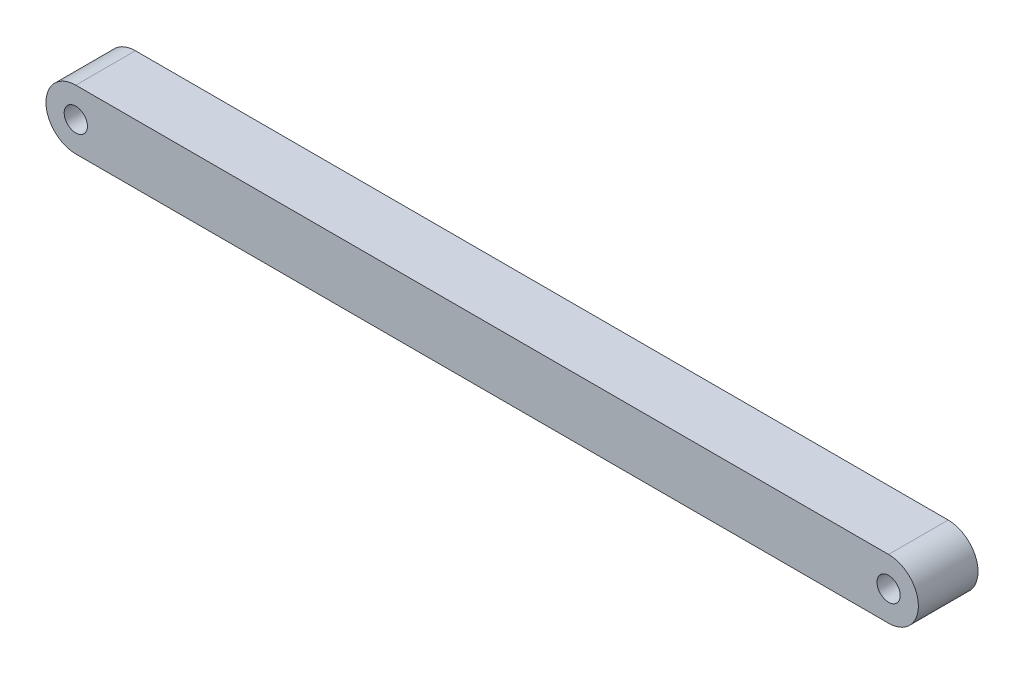
ISO-10303-21;
HEADER;
FILE_DESCRIPTION(('STEP AP214'),'2;1');
FILE_NAME('part.step','',(''),(''),'','','');
FILE_SCHEMA(('AUTOMOTIVE_DESIGN { 1 0 10303 214 1 1 1 1 }'));
ENDSEC;
DATA;
#1=APPLICATION_CONTEXT('core data for automotive mechanical design processes');
#2=APPLICATION_PROTOCOL_DEFINITION('international standard','automotive_design',2000,#1);
#3=PRODUCT_CONTEXT('',#1,'mechanical');
#4=PRODUCT('Part','Part','',(#3));
#5=PRODUCT_RELATED_PRODUCT_CATEGORY('part','',(#4));
#6=PRODUCT_DEFINITION_FORMATION('','',#4);
#7=PRODUCT_DEFINITION_CONTEXT('part definition',#1,'design');
#8=PRODUCT_DEFINITION('design','',#6,#7);
#9=PRODUCT_DEFINITION_SHAPE('','',#8);
#10=(LENGTH_UNIT() NAMED_UNIT(*) SI_UNIT(.MILLI.,.METRE.));
#11=(NAMED_UNIT(*) PLANE_ANGLE_UNIT() SI_UNIT($,.RADIAN.));
#12=(NAMED_UNIT(*) SI_UNIT($,.STERADIAN.) SOLID_ANGLE_UNIT());
#13=UNCERTAINTY_MEASURE_WITH_UNIT(LENGTH_MEASURE(1.E-05),#10,'distance_accuracy_value','');
#14=(GEOMETRIC_REPRESENTATION_CONTEXT(3) GLOBAL_UNCERTAINTY_ASSIGNED_CONTEXT((#13)) GLOBAL_UNIT_ASSIGNED_CONTEXT((#10,
#11,#12)) REPRESENTATION_CONTEXT('',''));
#15=CARTESIAN_POINT('',(0.,0.,0.));
#16=DIRECTION('',(0.,0.,1.));
#17=DIRECTION('',(1.,0.,0.));
#18=AXIS2_PLACEMENT_3D('',#15,#16,#17);
#19=CARTESIAN_POINT('',(150.,10.25,20.5));
#20=DIRECTION('',(0.,0.,1.));
#21=DIRECTION('',(1.,0.,0.));
#22=AXIS2_PLACEMENT_3D('',#19,#20,#21);
#23=PLANE('',#22);
#24=CARTESIAN_POINT('',(10.25,10.25,20.5));
#25=DIRECTION('',(0.,0.,1.));
#26=DIRECTION('',(1.,0.,0.));
#27=AXIS2_PLACEMENT_3D('',#24,#25,#26);
#28=CIRCLE('',#27,4.);
#29=CARTESIAN_POINT('',(14.25,10.25,20.5));
#30=VERTEX_POINT('',#29);
#31=EDGE_CURVE('E88',#30,#30,#28,.F.);
#32=ORIENTED_EDGE('',*,*,#31,.T.);
#33=EDGE_LOOP('',(#32));
#34=FACE_BOUND('',#33,.T.);
#35=CARTESIAN_POINT('',(289.75,10.25,20.5));
#36=DIRECTION('',(0.,0.,1.));
#37=DIRECTION('',(1.,0.,0.));
#38=AXIS2_PLACEMENT_3D('',#35,#36,#37);
#39=CIRCLE('',#38,4.);
#40=CARTESIAN_POINT('',(293.75,10.25,20.5));
#41=VERTEX_POINT('',#40);
#42=EDGE_CURVE('E91',#41,#41,#39,.F.);
#43=ORIENTED_EDGE('',*,*,#42,.T.);
#44=EDGE_LOOP('',(#43));
#45=FACE_BOUND('',#44,.T.);
#46=CARTESIAN_POINT('',(289.75,10.25,20.5));
#47=DIRECTION('',(0.,0.,1.));
#48=DIRECTION('',(1.,0.,0.));
#49=AXIS2_PLACEMENT_3D('',#46,#47,#48);
#50=CIRCLE('',#49,10.25);
#51=CARTESIAN_POINT('',(289.75,20.5,20.5));
#52=VERTEX_POINT('',#51);
#53=CARTESIAN_POINT('',(289.75,0.,20.5));
#54=VERTEX_POINT('',#53);
#55=EDGE_CURVE('E19',#52,#54,#50,.F.);
#56=ORIENTED_EDGE('',*,*,#55,.F.);
#57=DIRECTION('',(1.,0.,0.));
#58=VECTOR('',#57,1.);
#59=CARTESIAN_POINT('',(300.,20.5,20.5));
#60=LINE('',#59,#58);
#61=CARTESIAN_POINT('',(10.25,20.5,20.5));
#62=VERTEX_POINT('',#61);
#63=EDGE_CURVE('E53',#62,#52,#60,.T.);
#64=ORIENTED_EDGE('',*,*,#63,.F.);
#65=CARTESIAN_POINT('',(10.25,10.25,20.5));
#66=DIRECTION('',(0.,0.,1.));
#67=DIRECTION('',(1.,0.,0.));
#68=AXIS2_PLACEMENT_3D('',#65,#66,#67);
#69=CIRCLE('',#68,10.25);
#70=CARTESIAN_POINT('',(10.25,0.,20.5));
#71=VERTEX_POINT('',#70);
#72=EDGE_CURVE('E68',#71,#62,#69,.F.);
#73=ORIENTED_EDGE('',*,*,#72,.F.);
#74=DIRECTION('',(1.,0.,0.));
#75=VECTOR('',#74,1.);
#76=CARTESIAN_POINT('',(0.,0.,20.5));
#77=LINE('',#76,#75);
#78=EDGE_CURVE('E66',#54,#71,#77,.F.);
#79=ORIENTED_EDGE('',*,*,#78,.F.);
#80=EDGE_LOOP('',(#56,#64,#73,#79));
#81=FACE_BOUND('',#80,.T.);
#82=ADVANCED_FACE('F16',(#34,#45,#81),#23,.T.);
#83=CARTESIAN_POINT('',(0.,0.,0.));
#84=DIRECTION('',(0.,-1.,0.));
#85=DIRECTION('',(0.,0.,-1.));
#86=AXIS2_PLACEMENT_3D('',#83,#84,#85);
#87=PLANE('',#86);
#88=DIRECTION('',(0.,0.,1.));
#89=VECTOR('',#88,1.);
#90=CARTESIAN_POINT('',(289.75,0.,0.));
#91=LINE('',#90,#89);
#92=CARTESIAN_POINT('',(289.75,0.,0.));
#93=VERTEX_POINT('',#92);
#94=EDGE_CURVE('E62',#54,#93,#91,.F.);
#95=ORIENTED_EDGE('',*,*,#94,.F.);
#96=ORIENTED_EDGE('',*,*,#78,.T.);
#97=DIRECTION('',(0.,0.,1.));
#98=VECTOR('',#97,1.);
#99=CARTESIAN_POINT('',(10.25,0.,0.));
#100=LINE('',#99,#98);
#101=CARTESIAN_POINT('',(10.25,0.,0.));
#102=VERTEX_POINT('',#101);
#103=EDGE_CURVE('E93',#102,#71,#100,.T.);
#104=ORIENTED_EDGE('',*,*,#103,.F.);
#105=DIRECTION('',(1.,0.,0.));
#106=VECTOR('',#105,1.);
#107=CARTESIAN_POINT('',(150.,0.,0.));
#108=LINE('',#107,#106);
#109=EDGE_CURVE('E75',#102,#93,#108,.T.);
#110=ORIENTED_EDGE('',*,*,#109,.T.);
#111=EDGE_LOOP('',(#95,#96,#104,#110));
#112=FACE_BOUND('',#111,.T.);
#113=ADVANCED_FACE('F74',(#112),#87,.T.);
#114=CARTESIAN_POINT('',(289.75,10.25,0.));
#115=DIRECTION('',(0.,0.,1.));
#116=DIRECTION('',(1.,0.,0.));
#117=AXIS2_PLACEMENT_3D('',#114,#115,#116);
#118=CYLINDRICAL_SURFACE('',#117,10.25);
#119=CARTESIAN_POINT('',(289.75,10.25,0.));
#120=DIRECTION('',(0.,0.,1.));
#121=DIRECTION('',(1.,0.,0.));
#122=AXIS2_PLACEMENT_3D('',#119,#120,#121);
#123=CIRCLE('',#122,10.25);
#124=CARTESIAN_POINT('',(289.75,20.5,0.));
#125=VERTEX_POINT('',#124);
#126=EDGE_CURVE('E86',#93,#125,#123,.T.);
#127=ORIENTED_EDGE('',*,*,#126,.T.);
#128=DIRECTION('',(0.,0.,1.));
#129=VECTOR('',#128,1.);
#130=CARTESIAN_POINT('',(289.75,20.5,0.));
#131=LINE('',#130,#129);
#132=EDGE_CURVE('E64',#52,#125,#131,.F.);
#133=ORIENTED_EDGE('',*,*,#132,.F.);
#134=ORIENTED_EDGE('',*,*,#55,.T.);
#135=ORIENTED_EDGE('',*,*,#94,.T.);
#136=EDGE_LOOP('',(#127,#133,#134,#135));
#137=FACE_BOUND('',#136,.T.);
#138=ADVANCED_FACE('F60',(#137),#118,.T.);
#139=CARTESIAN_POINT('',(300.,20.5,0.));
#140=DIRECTION('',(0.,1.,0.));
#141=DIRECTION('',(0.,0.,1.));
#142=AXIS2_PLACEMENT_3D('',#139,#140,#141);
#143=PLANE('',#142);
#144=ORIENTED_EDGE('',*,*,#132,.T.);
#145=DIRECTION('',(1.,0.,0.));
#146=VECTOR('',#145,1.);
#147=CARTESIAN_POINT('',(150.,20.5,0.));
#148=LINE('',#147,#146);
#149=CARTESIAN_POINT('',(10.25,20.5,0.));
#150=VERTEX_POINT('',#149);
#151=EDGE_CURVE('E85',#125,#150,#148,.F.);
#152=ORIENTED_EDGE('',*,*,#151,.T.);
#153=DIRECTION('',(0.,0.,1.));
#154=VECTOR('',#153,1.);
#155=CARTESIAN_POINT('',(10.25,20.5,0.));
#156=LINE('',#155,#154);
#157=EDGE_CURVE('E34',#62,#150,#156,.F.);
#158=ORIENTED_EDGE('',*,*,#157,.F.);
#159=ORIENTED_EDGE('',*,*,#63,.T.);
#160=EDGE_LOOP('',(#144,#152,#158,#159));
#161=FACE_BOUND('',#160,.T.);
#162=ADVANCED_FACE('F97',(#161),#143,.T.);
#163=CARTESIAN_POINT('',(10.25,10.25,0.));
#164=DIRECTION('',(0.,0.,1.));
#165=DIRECTION('',(1.,0.,0.));
#166=AXIS2_PLACEMENT_3D('',#163,#164,#165);
#167=CYLINDRICAL_SURFACE('',#166,10.25);
#168=CARTESIAN_POINT('',(10.25,10.25,0.));
#169=DIRECTION('',(0.,0.,1.));
#170=DIRECTION('',(1.,0.,0.));
#171=AXIS2_PLACEMENT_3D('',#168,#169,#170);
#172=CIRCLE('',#171,10.25);
#173=EDGE_CURVE('E83',#150,#102,#172,.T.);
#174=ORIENTED_EDGE('',*,*,#173,.T.);
#175=ORIENTED_EDGE('',*,*,#103,.T.);
#176=ORIENTED_EDGE('',*,*,#72,.T.);
#177=ORIENTED_EDGE('',*,*,#157,.T.);
#178=EDGE_LOOP('',(#174,#175,#176,#177));
#179=FACE_BOUND('',#178,.T.);
#180=ADVANCED_FACE('F102',(#179),#167,.T.);
#181=CARTESIAN_POINT('',(289.75,10.25,-280.897577959744));
#182=DIRECTION('',(0.,0.,1.));
#183=DIRECTION('',(1.,0.,0.));
#184=AXIS2_PLACEMENT_3D('',#181,#182,#183);
#185=CYLINDRICAL_SURFACE('',#184,4.);
#186=ORIENTED_EDGE('',*,*,#42,.F.);
#187=EDGE_LOOP('',(#186));
#188=FACE_BOUND('',#187,.T.);
#189=CARTESIAN_POINT('',(289.75,10.25,0.));
#190=DIRECTION('',(0.,0.,1.));
#191=DIRECTION('',(1.,0.,0.));
#192=AXIS2_PLACEMENT_3D('',#189,#190,#191);
#193=CIRCLE('',#192,4.);
#194=CARTESIAN_POINT('',(293.75,10.25,0.));
#195=VERTEX_POINT('',#194);
#196=EDGE_CURVE('E25',#195,#195,#193,.F.);
#197=ORIENTED_EDGE('',*,*,#196,.T.);
#198=EDGE_LOOP('',(#197));
#199=FACE_BOUND('',#198,.T.);
#200=ADVANCED_FACE('F104',(#188,#199),#185,.F.);
#201=CARTESIAN_POINT('',(10.25,10.25,-280.897577959744));
#202=DIRECTION('',(0.,0.,1.));
#203=DIRECTION('',(1.,0.,0.));
#204=AXIS2_PLACEMENT_3D('',#201,#202,#203);
#205=CYLINDRICAL_SURFACE('',#204,4.);
#206=ORIENTED_EDGE('',*,*,#31,.F.);
#207=EDGE_LOOP('',(#206));
#208=FACE_BOUND('',#207,.T.);
#209=CARTESIAN_POINT('',(10.25,10.25,0.));
#210=DIRECTION('',(0.,0.,1.));
#211=DIRECTION('',(1.,0.,0.));
#212=AXIS2_PLACEMENT_3D('',#209,#210,#211);
#213=CIRCLE('',#212,4.);
#214=CARTESIAN_POINT('',(14.25,10.25,0.));
#215=VERTEX_POINT('',#214);
#216=EDGE_CURVE('E10',#215,#215,#213,.F.);
#217=ORIENTED_EDGE('',*,*,#216,.T.);
#218=EDGE_LOOP('',(#217));
#219=FACE_BOUND('',#218,.T.);
#220=ADVANCED_FACE('F111',(#208,#219),#205,.F.);
#221=CARTESIAN_POINT('',(150.,10.25,0.));
#222=DIRECTION('',(0.,0.,1.));
#223=DIRECTION('',(1.,0.,0.));
#224=AXIS2_PLACEMENT_3D('',#221,#222,#223);
#225=PLANE('',#224);
#226=ORIENTED_EDGE('',*,*,#216,.F.);
#227=EDGE_LOOP('',(#226));
#228=FACE_BOUND('',#227,.T.);
#229=ORIENTED_EDGE('',*,*,#196,.F.);
#230=EDGE_LOOP('',(#229));
#231=FACE_BOUND('',#230,.T.);
#232=ORIENTED_EDGE('',*,*,#151,.F.);
#233=ORIENTED_EDGE('',*,*,#126,.F.);
#234=ORIENTED_EDGE('',*,*,#109,.F.);
#235=ORIENTED_EDGE('',*,*,#173,.F.);
#236=EDGE_LOOP('',(#232,#233,#234,#235));
#237=FACE_BOUND('',#236,.T.);
#238=ADVANCED_FACE('F99',(#228,#231,#237),#225,.F.);
#239=CLOSED_SHELL('',(#82,#113,#138,#162,#180,#200,#220,#238));
#240=MANIFOLD_SOLID_BREP('B1',#239);
#241=ADVANCED_BREP_SHAPE_REPRESENTATION('',(#18,#240),#14);
#242=SHAPE_DEFINITION_REPRESENTATION(#9,#241);
ENDSEC;
END-ISO-10303-21;
